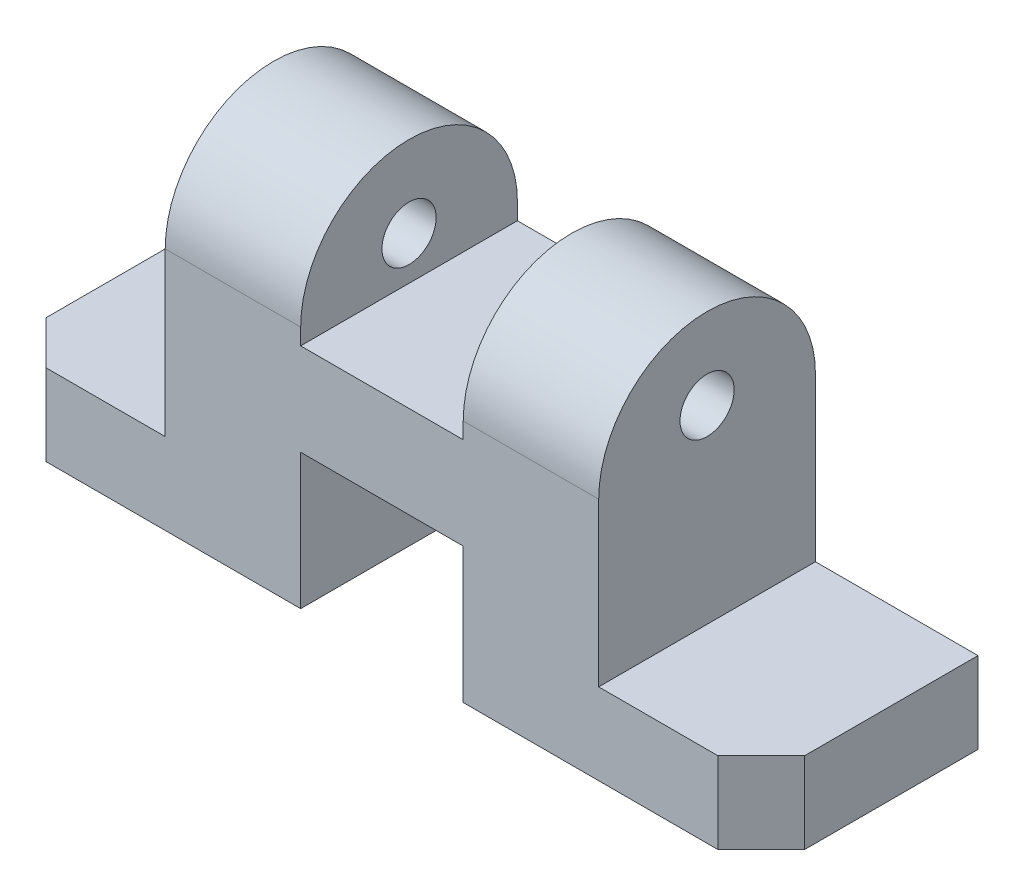
ISO-10303-21;
HEADER;
FILE_DESCRIPTION(('STEP AP214'),'2;1');
FILE_NAME('part.step','',(''),(''),'','','');
FILE_SCHEMA(('AUTOMOTIVE_DESIGN { 1 0 10303 214 1 1 1 1 }'));
ENDSEC;
DATA;
#1=APPLICATION_CONTEXT('core data for automotive mechanical design processes');
#2=APPLICATION_PROTOCOL_DEFINITION('international standard','automotive_design',2000,#1);
#3=PRODUCT_CONTEXT('',#1,'mechanical');
#4=PRODUCT('Part','Part','',(#3));
#5=PRODUCT_RELATED_PRODUCT_CATEGORY('part','',(#4));
#6=PRODUCT_DEFINITION_FORMATION('','',#4);
#7=PRODUCT_DEFINITION_CONTEXT('part definition',#1,'design');
#8=PRODUCT_DEFINITION('design','',#6,#7);
#9=PRODUCT_DEFINITION_SHAPE('','',#8);
#10=(LENGTH_UNIT() NAMED_UNIT(*) SI_UNIT(.MILLI.,.METRE.));
#11=(NAMED_UNIT(*) PLANE_ANGLE_UNIT() SI_UNIT($,.RADIAN.));
#12=(NAMED_UNIT(*) SI_UNIT($,.STERADIAN.) SOLID_ANGLE_UNIT());
#13=UNCERTAINTY_MEASURE_WITH_UNIT(LENGTH_MEASURE(1.E-05),#10,'distance_accuracy_value','');
#14=(GEOMETRIC_REPRESENTATION_CONTEXT(3) GLOBAL_UNCERTAINTY_ASSIGNED_CONTEXT((#13)) GLOBAL_UNIT_ASSIGNED_CONTEXT((#10,
#11,#12)) REPRESENTATION_CONTEXT('',''));
#15=CARTESIAN_POINT('',(0.,0.,0.));
#16=DIRECTION('',(0.,0.,1.));
#17=DIRECTION('',(1.,0.,0.));
#18=AXIS2_PLACEMENT_3D('',#15,#16,#17);
#19=CARTESIAN_POINT('',(40.,15.,20.));
#20=DIRECTION('',(-1.,0.,0.));
#21=DIRECTION('',(0.,0.,1.));
#22=AXIS2_PLACEMENT_3D('',#19,#20,#21);
#23=PLANE('',#22);
#24=CARTESIAN_POINT('',(40.,50.,0.));
#25=DIRECTION('',(1.,0.,0.));
#26=DIRECTION('',(0.,0.,-1.));
#27=AXIS2_PLACEMENT_3D('',#24,#25,#26);
#28=CIRCLE('',#27,5.00000000000001);
#29=CARTESIAN_POINT('',(40.,50.,-5.00000000000001));
#30=VERTEX_POINT('',#29);
#31=EDGE_CURVE('E312',#30,#30,#28,.T.);
#32=ORIENTED_EDGE('',*,*,#31,.F.);
#33=EDGE_LOOP('',(#32));
#34=FACE_BOUND('',#33,.T.);
#35=CARTESIAN_POINT('',(40.,45.,0.));
#36=DIRECTION('',(-1.,0.,0.));
#37=DIRECTION('',(0.,0.,1.));
#38=AXIS2_PLACEMENT_3D('',#35,#36,#37);
#39=CIRCLE('',#38,20.);
#40=CARTESIAN_POINT('',(40.,45.,-20.));
#41=VERTEX_POINT('',#40);
#42=CARTESIAN_POINT('',(40.,45.,20.));
#43=VERTEX_POINT('',#42);
#44=EDGE_CURVE('E216',#41,#43,#39,.F.);
#45=ORIENTED_EDGE('',*,*,#44,.T.);
#46=DIRECTION('',(0.,1.,0.));
#47=VECTOR('',#46,1.);
#48=CARTESIAN_POINT('',(40.,15.,20.));
#49=LINE('',#48,#47);
#50=CARTESIAN_POINT('',(40.,15.,20.));
#51=VERTEX_POINT('',#50);
#52=EDGE_CURVE('E382',#51,#43,#49,.T.);
#53=ORIENTED_EDGE('',*,*,#52,.F.);
#54=DIRECTION('',(0.,0.,-1.));
#55=VECTOR('',#54,1.);
#56=CARTESIAN_POINT('',(40.,15.,20.));
#57=LINE('',#56,#55);
#58=CARTESIAN_POINT('',(40.,15.,-20.));
#59=VERTEX_POINT('',#58);
#60=EDGE_CURVE('E277',#51,#59,#57,.T.);
#61=ORIENTED_EDGE('',*,*,#60,.T.);
#62=DIRECTION('',(0.,1.,0.));
#63=VECTOR('',#62,1.);
#64=CARTESIAN_POINT('',(40.,15.,-20.));
#65=LINE('',#64,#63);
#66=EDGE_CURVE('E236',#59,#41,#65,.T.);
#67=ORIENTED_EDGE('',*,*,#66,.T.);
#68=EDGE_LOOP('',(#45,#53,#61,#67));
#69=FACE_BOUND('',#68,.T.);
#70=ADVANCED_FACE('F47',(#34,#69),#23,.F.);
#71=CARTESIAN_POINT('',(15.,65.,20.));
#72=DIRECTION('',(1.,0.,0.));
#73=DIRECTION('',(0.,1.,0.));
#74=AXIS2_PLACEMENT_3D('',#71,#72,#73);
#75=PLANE('',#74);
#76=CARTESIAN_POINT('',(15.,50.,0.));
#77=DIRECTION('',(1.,0.,0.));
#78=DIRECTION('',(0.,1.,0.));
#79=AXIS2_PLACEMENT_3D('',#76,#77,#78);
#80=CIRCLE('',#79,5.);
#81=CARTESIAN_POINT('',(15.,55.,0.));
#82=VERTEX_POINT('',#81);
#83=EDGE_CURVE('E307',#82,#82,#80,.T.);
#84=ORIENTED_EDGE('',*,*,#83,.T.);
#85=EDGE_LOOP('',(#84));
#86=FACE_BOUND('',#85,.T.);
#87=DIRECTION('',(0.,-1.,0.));
#88=VECTOR('',#87,1.);
#89=CARTESIAN_POINT('',(15.,65.,20.));
#90=LINE('',#89,#88);
#91=CARTESIAN_POINT('',(15.,45.,20.));
#92=VERTEX_POINT('',#91);
#93=CARTESIAN_POINT('',(15.,42.,20.));
#94=VERTEX_POINT('',#93);
#95=EDGE_CURVE('E354',#92,#94,#90,.T.);
#96=ORIENTED_EDGE('',*,*,#95,.F.);
#97=CARTESIAN_POINT('',(15.,45.,0.));
#98=DIRECTION('',(1.,0.,0.));
#99=DIRECTION('',(0.,1.,0.));
#100=AXIS2_PLACEMENT_3D('',#97,#98,#99);
#101=CIRCLE('',#100,20.);
#102=CARTESIAN_POINT('',(15.,45.,-20.));
#103=VERTEX_POINT('',#102);
#104=EDGE_CURVE('E353',#92,#103,#101,.F.);
#105=ORIENTED_EDGE('',*,*,#104,.T.);
#106=DIRECTION('',(0.,-1.,0.));
#107=VECTOR('',#106,1.);
#108=CARTESIAN_POINT('',(15.,65.,-20.));
#109=LINE('',#108,#107);
#110=CARTESIAN_POINT('',(15.,42.,-20.));
#111=VERTEX_POINT('',#110);
#112=EDGE_CURVE('E240',#103,#111,#109,.T.);
#113=ORIENTED_EDGE('',*,*,#112,.T.);
#114=DIRECTION('',(0.,0.,-1.));
#115=VECTOR('',#114,1.);
#116=CARTESIAN_POINT('',(15.,42.,20.));
#117=LINE('',#116,#115);
#118=EDGE_CURVE('E273',#94,#111,#117,.T.);
#119=ORIENTED_EDGE('',*,*,#118,.F.);
#120=EDGE_LOOP('',(#96,#105,#113,#119));
#121=FACE_BOUND('',#120,.T.);
#122=ADVANCED_FACE('F352',(#86,#121),#75,.F.);
#123=CARTESIAN_POINT('',(-15.,65.,20.));
#124=DIRECTION('',(-1.,0.,0.));
#125=DIRECTION('',(0.,-1.,0.));
#126=AXIS2_PLACEMENT_3D('',#123,#124,#125);
#127=PLANE('',#126);
#128=CARTESIAN_POINT('',(-15.,50.,0.));
#129=DIRECTION('',(-1.,0.,0.));
#130=DIRECTION('',(0.,-1.,0.));
#131=AXIS2_PLACEMENT_3D('',#128,#129,#130);
#132=CIRCLE('',#131,5.);
#133=CARTESIAN_POINT('',(-15.,45.,0.));
#134=VERTEX_POINT('',#133);
#135=EDGE_CURVE('E311',#134,#134,#132,.T.);
#136=ORIENTED_EDGE('',*,*,#135,.T.);
#137=EDGE_LOOP('',(#136));
#138=FACE_BOUND('',#137,.T.);
#139=CARTESIAN_POINT('',(-15.,45.,0.));
#140=DIRECTION('',(-1.,0.,0.));
#141=DIRECTION('',(0.,-1.,0.));
#142=AXIS2_PLACEMENT_3D('',#139,#140,#141);
#143=CIRCLE('',#142,20.);
#144=CARTESIAN_POINT('',(-15.,45.,-20.));
#145=VERTEX_POINT('',#144);
#146=CARTESIAN_POINT('',(-15.,45.,20.));
#147=VERTEX_POINT('',#146);
#148=EDGE_CURVE('E183',#145,#147,#143,.F.);
#149=ORIENTED_EDGE('',*,*,#148,.T.);
#150=DIRECTION('',(0.,1.,0.));
#151=VECTOR('',#150,1.);
#152=CARTESIAN_POINT('',(-15.,65.,20.));
#153=LINE('',#152,#151);
#154=CARTESIAN_POINT('',(-15.,42.,20.));
#155=VERTEX_POINT('',#154);
#156=EDGE_CURVE('E192',#155,#147,#153,.T.);
#157=ORIENTED_EDGE('',*,*,#156,.F.);
#158=DIRECTION('',(0.,0.,-1.));
#159=VECTOR('',#158,1.);
#160=CARTESIAN_POINT('',(-15.,42.,20.));
#161=LINE('',#160,#159);
#162=CARTESIAN_POINT('',(-15.,42.,-20.));
#163=VERTEX_POINT('',#162);
#164=EDGE_CURVE('E269',#155,#163,#161,.T.);
#165=ORIENTED_EDGE('',*,*,#164,.T.);
#166=DIRECTION('',(0.,1.,0.));
#167=VECTOR('',#166,1.);
#168=CARTESIAN_POINT('',(-15.,65.,-20.));
#169=LINE('',#168,#167);
#170=EDGE_CURVE('E246',#163,#145,#169,.T.);
#171=ORIENTED_EDGE('',*,*,#170,.T.);
#172=EDGE_LOOP('',(#149,#157,#165,#171));
#173=FACE_BOUND('',#172,.T.);
#174=ADVANCED_FACE('F341',(#138,#173),#127,.F.);
#175=CARTESIAN_POINT('',(-40.,15.,20.));
#176=DIRECTION('',(1.,0.,0.));
#177=DIRECTION('',(0.,0.,-1.));
#178=AXIS2_PLACEMENT_3D('',#175,#176,#177);
#179=PLANE('',#178);
#180=CARTESIAN_POINT('',(-40.,50.,0.));
#181=DIRECTION('',(1.,0.,0.));
#182=DIRECTION('',(0.,0.,-1.));
#183=AXIS2_PLACEMENT_3D('',#180,#181,#182);
#184=CIRCLE('',#183,5.);
#185=CARTESIAN_POINT('',(-40.,50.,-5.));
#186=VERTEX_POINT('',#185);
#187=EDGE_CURVE('E184',#186,#186,#184,.T.);
#188=ORIENTED_EDGE('',*,*,#187,.T.);
#189=EDGE_LOOP('',(#188));
#190=FACE_BOUND('',#189,.T.);
#191=DIRECTION('',(0.,-1.,0.));
#192=VECTOR('',#191,1.);
#193=CARTESIAN_POINT('',(-40.,15.,20.));
#194=LINE('',#193,#192);
#195=CARTESIAN_POINT('',(-40.,45.,20.));
#196=VERTEX_POINT('',#195);
#197=CARTESIAN_POINT('',(-40.,15.,20.));
#198=VERTEX_POINT('',#197);
#199=EDGE_CURVE('E189',#196,#198,#194,.T.);
#200=ORIENTED_EDGE('',*,*,#199,.F.);
#201=CARTESIAN_POINT('',(-40.,45.,0.));
#202=DIRECTION('',(1.,0.,0.));
#203=DIRECTION('',(0.,0.,1.));
#204=AXIS2_PLACEMENT_3D('',#201,#202,#203);
#205=CIRCLE('',#204,20.);
#206=CARTESIAN_POINT('',(-40.,45.,-20.));
#207=VERTEX_POINT('',#206);
#208=EDGE_CURVE('E172',#207,#196,#205,.T.);
#209=ORIENTED_EDGE('',*,*,#208,.F.);
#210=DIRECTION('',(0.,-1.,0.));
#211=VECTOR('',#210,1.);
#212=CARTESIAN_POINT('',(-40.,15.,-20.));
#213=LINE('',#212,#211);
#214=CARTESIAN_POINT('',(-40.,15.,-20.));
#215=VERTEX_POINT('',#214);
#216=EDGE_CURVE('E250',#207,#215,#213,.T.);
#217=ORIENTED_EDGE('',*,*,#216,.T.);
#218=DIRECTION('',(0.,0.,-1.));
#219=VECTOR('',#218,1.);
#220=CARTESIAN_POINT('',(-40.,15.,20.));
#221=LINE('',#220,#219);
#222=EDGE_CURVE('E198',#198,#215,#221,.T.);
#223=ORIENTED_EDGE('',*,*,#222,.F.);
#224=EDGE_LOOP('',(#200,#209,#217,#223));
#225=FACE_BOUND('',#224,.T.);
#226=ADVANCED_FACE('F196',(#190,#225),#179,.F.);
#227=CARTESIAN_POINT('',(0.,0.,20.));
#228=DIRECTION('',(0.,0.,1.));
#229=DIRECTION('',(1.,0.,0.));
#230=AXIS2_PLACEMENT_3D('',#227,#228,#229);
#231=PLANE('',#230);
#232=DIRECTION('',(-1.,0.,0.));
#233=VECTOR('',#232,1.);
#234=CARTESIAN_POINT('',(-70.,15.,20.));
#235=LINE('',#234,#233);
#236=CARTESIAN_POINT('',(-62.,15.,20.));
#237=VERTEX_POINT('',#236);
#238=EDGE_CURVE('E201',#198,#237,#235,.T.);
#239=ORIENTED_EDGE('',*,*,#238,.T.);
#240=DIRECTION('',(0.,-1.,0.));
#241=VECTOR('',#240,1.);
#242=CARTESIAN_POINT('',(-62.,0.,20.));
#243=LINE('',#242,#241);
#244=CARTESIAN_POINT('',(-62.,0.,20.));
#245=VERTEX_POINT('',#244);
#246=EDGE_CURVE('E317',#237,#245,#243,.T.);
#247=ORIENTED_EDGE('',*,*,#246,.T.);
#248=DIRECTION('',(1.,0.,0.));
#249=VECTOR('',#248,1.);
#250=CARTESIAN_POINT('',(-70.,0.,20.));
#251=LINE('',#250,#249);
#252=CARTESIAN_POINT('',(-15.,0.,20.));
#253=VERTEX_POINT('',#252);
#254=EDGE_CURVE('E261',#245,#253,#251,.T.);
#255=ORIENTED_EDGE('',*,*,#254,.T.);
#256=DIRECTION('',(0.,1.,0.));
#257=VECTOR('',#256,1.);
#258=CARTESIAN_POINT('',(-15.,0.,20.));
#259=LINE('',#258,#257);
#260=CARTESIAN_POINT('',(-15.,25.,20.));
#261=VERTEX_POINT('',#260);
#262=EDGE_CURVE('E366',#253,#261,#259,.T.);
#263=ORIENTED_EDGE('',*,*,#262,.T.);
#264=DIRECTION('',(1.,0.,0.));
#265=VECTOR('',#264,1.);
#266=CARTESIAN_POINT('',(-15.,25.,20.));
#267=LINE('',#266,#265);
#268=CARTESIAN_POINT('',(15.,25.,20.));
#269=VERTEX_POINT('',#268);
#270=EDGE_CURVE('E369',#261,#269,#267,.T.);
#271=ORIENTED_EDGE('',*,*,#270,.T.);
#272=DIRECTION('',(0.,-1.,0.));
#273=VECTOR('',#272,1.);
#274=CARTESIAN_POINT('',(15.,25.,20.));
#275=LINE('',#274,#273);
#276=CARTESIAN_POINT('',(15.,0.,20.));
#277=VERTEX_POINT('',#276);
#278=EDGE_CURVE('E372',#269,#277,#275,.T.);
#279=ORIENTED_EDGE('',*,*,#278,.T.);
#280=DIRECTION('',(1.,0.,0.));
#281=VECTOR('',#280,1.);
#282=CARTESIAN_POINT('',(15.,0.,20.));
#283=LINE('',#282,#281);
#284=CARTESIAN_POINT('',(62.,0.,20.));
#285=VERTEX_POINT('',#284);
#286=EDGE_CURVE('E375',#277,#285,#283,.T.);
#287=ORIENTED_EDGE('',*,*,#286,.T.);
#288=DIRECTION('',(0.,1.,0.));
#289=VECTOR('',#288,1.);
#290=CARTESIAN_POINT('',(62.,15.,20.));
#291=LINE('',#290,#289);
#292=CARTESIAN_POINT('',(62.,15.,20.));
#293=VERTEX_POINT('',#292);
#294=EDGE_CURVE('E313',#285,#293,#291,.T.);
#295=ORIENTED_EDGE('',*,*,#294,.T.);
#296=DIRECTION('',(-1.,0.,0.));
#297=VECTOR('',#296,1.);
#298=CARTESIAN_POINT('',(70.,15.,20.));
#299=LINE('',#298,#297);
#300=EDGE_CURVE('E379',#293,#51,#299,.T.);
#301=ORIENTED_EDGE('',*,*,#300,.T.);
#302=ORIENTED_EDGE('',*,*,#52,.T.);
#303=DIRECTION('',(-1.,0.,0.));
#304=VECTOR('',#303,1.);
#305=CARTESIAN_POINT('',(70.,45.,20.));
#306=LINE('',#305,#304);
#307=EDGE_CURVE('E194',#43,#92,#306,.T.);
#308=ORIENTED_EDGE('',*,*,#307,.T.);
#309=ORIENTED_EDGE('',*,*,#95,.T.);
#310=DIRECTION('',(-1.,0.,0.));
#311=VECTOR('',#310,1.);
#312=CARTESIAN_POINT('',(-15.,42.,20.));
#313=LINE('',#312,#311);
#314=EDGE_CURVE('E207',#94,#155,#313,.T.);
#315=ORIENTED_EDGE('',*,*,#314,.T.);
#316=ORIENTED_EDGE('',*,*,#156,.T.);
#317=EDGE_CURVE('E175',#147,#196,#306,.T.);
#318=ORIENTED_EDGE('',*,*,#317,.T.);
#319=ORIENTED_EDGE('',*,*,#199,.T.);
#320=EDGE_LOOP('',(#239,#247,#255,#263,#271,#279,#287,#295,#301,#302,#308,#309,#315,#316,#318,#319));
#321=FACE_BOUND('',#320,.T.);
#322=ADVANCED_FACE('F188',(#321),#231,.T.);
#323=CARTESIAN_POINT('',(-70.,0.,20.));
#324=DIRECTION('',(0.,1.,0.));
#325=DIRECTION('',(0.,0.,1.));
#326=AXIS2_PLACEMENT_3D('',#323,#324,#325);
#327=PLANE('',#326);
#328=ORIENTED_EDGE('',*,*,#254,.F.);
#329=DIRECTION('',(-0.707106781186546,0.,-0.707106781186549));
#330=VECTOR('',#329,1.);
#331=CARTESIAN_POINT('',(-62.,0.,20.));
#332=LINE('',#331,#330);
#333=CARTESIAN_POINT('',(-70.,0.,12.));
#334=VERTEX_POINT('',#333);
#335=EDGE_CURVE('E321',#245,#334,#332,.T.);
#336=ORIENTED_EDGE('',*,*,#335,.T.);
#337=DIRECTION('',(0.,0.,-1.));
#338=VECTOR('',#337,1.);
#339=CARTESIAN_POINT('',(-70.,0.,20.));
#340=LINE('',#339,#338);
#341=CARTESIAN_POINT('',(-70.,0.,-20.));
#342=VERTEX_POINT('',#341);
#343=EDGE_CURVE('E205',#334,#342,#340,.T.);
#344=ORIENTED_EDGE('',*,*,#343,.T.);
#345=DIRECTION('',(1.,0.,0.));
#346=VECTOR('',#345,1.);
#347=CARTESIAN_POINT('',(-70.,0.,-20.));
#348=LINE('',#347,#346);
#349=CARTESIAN_POINT('',(-15.,0.,-20.));
#350=VERTEX_POINT('',#349);
#351=EDGE_CURVE('E211',#342,#350,#348,.T.);
#352=ORIENTED_EDGE('',*,*,#351,.T.);
#353=DIRECTION('',(0.,0.,-1.));
#354=VECTOR('',#353,1.);
#355=CARTESIAN_POINT('',(-15.,0.,20.));
#356=LINE('',#355,#354);
#357=EDGE_CURVE('E299',#253,#350,#356,.T.);
#358=ORIENTED_EDGE('',*,*,#357,.F.);
#359=EDGE_LOOP('',(#328,#336,#344,#352,#358));
#360=FACE_BOUND('',#359,.T.);
#361=ADVANCED_FACE('F420',(#360),#327,.F.);
#362=CARTESIAN_POINT('',(-15.,0.,20.));
#363=DIRECTION('',(-1.,0.,0.));
#364=DIRECTION('',(0.,0.,1.));
#365=AXIS2_PLACEMENT_3D('',#362,#363,#364);
#366=PLANE('',#365);
#367=DIRECTION('',(0.,1.,0.));
#368=VECTOR('',#367,1.);
#369=CARTESIAN_POINT('',(-15.,0.,-20.));
#370=LINE('',#369,#368);
#371=CARTESIAN_POINT('',(-15.,25.,-20.));
#372=VERTEX_POINT('',#371);
#373=EDGE_CURVE('E215',#350,#372,#370,.T.);
#374=ORIENTED_EDGE('',*,*,#373,.T.);
#375=DIRECTION('',(0.,0.,-1.));
#376=VECTOR('',#375,1.);
#377=CARTESIAN_POINT('',(-15.,25.,20.));
#378=LINE('',#377,#376);
#379=EDGE_CURVE('E295',#261,#372,#378,.T.);
#380=ORIENTED_EDGE('',*,*,#379,.F.);
#381=ORIENTED_EDGE('',*,*,#262,.F.);
#382=ORIENTED_EDGE('',*,*,#357,.T.);
#383=EDGE_LOOP('',(#374,#380,#381,#382));
#384=FACE_BOUND('',#383,.T.);
#385=ADVANCED_FACE('F414',(#384),#366,.F.);
#386=CARTESIAN_POINT('',(-15.,25.,20.));
#387=DIRECTION('',(0.,1.,0.));
#388=DIRECTION('',(0.,0.,1.));
#389=AXIS2_PLACEMENT_3D('',#386,#387,#388);
#390=PLANE('',#389);
#391=DIRECTION('',(1.,0.,0.));
#392=VECTOR('',#391,1.);
#393=CARTESIAN_POINT('',(-15.,25.,-20.));
#394=LINE('',#393,#392);
#395=CARTESIAN_POINT('',(15.,25.,-20.));
#396=VERTEX_POINT('',#395);
#397=EDGE_CURVE('E219',#372,#396,#394,.T.);
#398=ORIENTED_EDGE('',*,*,#397,.T.);
#399=DIRECTION('',(0.,0.,-1.));
#400=VECTOR('',#399,1.);
#401=CARTESIAN_POINT('',(15.,25.,20.));
#402=LINE('',#401,#400);
#403=EDGE_CURVE('E291',#269,#396,#402,.T.);
#404=ORIENTED_EDGE('',*,*,#403,.F.);
#405=ORIENTED_EDGE('',*,*,#270,.F.);
#406=ORIENTED_EDGE('',*,*,#379,.T.);
#407=EDGE_LOOP('',(#398,#404,#405,#406));
#408=FACE_BOUND('',#407,.T.);
#409=ADVANCED_FACE('F410',(#408),#390,.F.);
#410=CARTESIAN_POINT('',(15.,25.,20.));
#411=DIRECTION('',(1.,0.,0.));
#412=DIRECTION('',(0.,0.,-1.));
#413=AXIS2_PLACEMENT_3D('',#410,#411,#412);
#414=PLANE('',#413);
#415=DIRECTION('',(0.,-1.,0.));
#416=VECTOR('',#415,1.);
#417=CARTESIAN_POINT('',(15.,25.,-20.));
#418=LINE('',#417,#416);
#419=CARTESIAN_POINT('',(15.,0.,-20.));
#420=VERTEX_POINT('',#419);
#421=EDGE_CURVE('E222',#396,#420,#418,.T.);
#422=ORIENTED_EDGE('',*,*,#421,.T.);
#423=DIRECTION('',(0.,0.,-1.));
#424=VECTOR('',#423,1.);
#425=CARTESIAN_POINT('',(15.,0.,20.));
#426=LINE('',#425,#424);
#427=EDGE_CURVE('E287',#277,#420,#426,.T.);
#428=ORIENTED_EDGE('',*,*,#427,.F.);
#429=ORIENTED_EDGE('',*,*,#278,.F.);
#430=ORIENTED_EDGE('',*,*,#403,.T.);
#431=EDGE_LOOP('',(#422,#428,#429,#430));
#432=FACE_BOUND('',#431,.T.);
#433=ADVANCED_FACE('F405',(#432),#414,.F.);
#434=CARTESIAN_POINT('',(15.,0.,20.));
#435=DIRECTION('',(0.,1.,0.));
#436=DIRECTION('',(0.,0.,1.));
#437=AXIS2_PLACEMENT_3D('',#434,#435,#436);
#438=PLANE('',#437);
#439=DIRECTION('',(0.,0.,-1.));
#440=VECTOR('',#439,1.);
#441=CARTESIAN_POINT('',(70.,0.,20.));
#442=LINE('',#441,#440);
#443=CARTESIAN_POINT('',(70.,0.,12.));
#444=VERTEX_POINT('',#443);
#445=CARTESIAN_POINT('',(70.,0.,-20.));
#446=VERTEX_POINT('',#445);
#447=EDGE_CURVE('E284',#444,#446,#442,.T.);
#448=ORIENTED_EDGE('',*,*,#447,.F.);
#449=DIRECTION('',(-0.707106781186546,0.,0.707106781186549));
#450=VECTOR('',#449,1.);
#451=CARTESIAN_POINT('',(62.,0.,20.));
#452=LINE('',#451,#450);
#453=EDGE_CURVE('E11',#444,#285,#452,.T.);
#454=ORIENTED_EDGE('',*,*,#453,.T.);
#455=ORIENTED_EDGE('',*,*,#286,.F.);
#456=ORIENTED_EDGE('',*,*,#427,.T.);
#457=DIRECTION('',(1.,0.,0.));
#458=VECTOR('',#457,1.);
#459=CARTESIAN_POINT('',(15.,0.,-20.));
#460=LINE('',#459,#458);
#461=EDGE_CURVE('E225',#420,#446,#460,.T.);
#462=ORIENTED_EDGE('',*,*,#461,.T.);
#463=EDGE_LOOP('',(#448,#454,#455,#456,#462));
#464=FACE_BOUND('',#463,.T.);
#465=ADVANCED_FACE('F399',(#464),#438,.F.);
#466=CARTESIAN_POINT('',(70.,0.,20.));
#467=DIRECTION('',(-1.,0.,0.));
#468=DIRECTION('',(0.,0.,1.));
#469=AXIS2_PLACEMENT_3D('',#466,#467,#468);
#470=PLANE('',#469);
#471=DIRECTION('',(0.,0.,-1.));
#472=VECTOR('',#471,1.);
#473=CARTESIAN_POINT('',(70.,15.,20.));
#474=LINE('',#473,#472);
#475=CARTESIAN_POINT('',(70.,15.,12.));
#476=VERTEX_POINT('',#475);
#477=CARTESIAN_POINT('',(70.,15.,-20.));
#478=VERTEX_POINT('',#477);
#479=EDGE_CURVE('E281',#476,#478,#474,.T.);
#480=ORIENTED_EDGE('',*,*,#479,.F.);
#481=DIRECTION('',(0.,-1.,0.));
#482=VECTOR('',#481,1.);
#483=CARTESIAN_POINT('',(70.,0.,12.));
#484=LINE('',#483,#482);
#485=EDGE_CURVE('E57',#476,#444,#484,.T.);
#486=ORIENTED_EDGE('',*,*,#485,.T.);
#487=ORIENTED_EDGE('',*,*,#447,.T.);
#488=DIRECTION('',(0.,1.,0.));
#489=VECTOR('',#488,1.);
#490=CARTESIAN_POINT('',(70.,0.,-20.));
#491=LINE('',#490,#489);
#492=EDGE_CURVE('E229',#446,#478,#491,.T.);
#493=ORIENTED_EDGE('',*,*,#492,.T.);
#494=EDGE_LOOP('',(#480,#486,#487,#493));
#495=FACE_BOUND('',#494,.T.);
#496=ADVANCED_FACE('F396',(#495),#470,.F.);
#497=CARTESIAN_POINT('',(70.,15.,20.));
#498=DIRECTION('',(0.,-1.,0.));
#499=DIRECTION('',(1.,0.,0.));
#500=AXIS2_PLACEMENT_3D('',#497,#498,#499);
#501=PLANE('',#500);
#502=ORIENTED_EDGE('',*,*,#300,.F.);
#503=DIRECTION('',(0.707106781186546,0.,-0.707106781186549));
#504=VECTOR('',#503,1.);
#505=CARTESIAN_POINT('',(62.,15.,20.));
#506=LINE('',#505,#504);
#507=EDGE_CURVE('E71',#293,#476,#506,.T.);
#508=ORIENTED_EDGE('',*,*,#507,.T.);
#509=ORIENTED_EDGE('',*,*,#479,.T.);
#510=DIRECTION('',(-1.,0.,0.));
#511=VECTOR('',#510,1.);
#512=CARTESIAN_POINT('',(70.,15.,-20.));
#513=LINE('',#512,#511);
#514=EDGE_CURVE('E233',#478,#59,#513,.T.);
#515=ORIENTED_EDGE('',*,*,#514,.T.);
#516=ORIENTED_EDGE('',*,*,#60,.F.);
#517=EDGE_LOOP('',(#502,#508,#509,#515,#516));
#518=FACE_BOUND('',#517,.T.);
#519=ADVANCED_FACE('F395',(#518),#501,.F.);
#520=CARTESIAN_POINT('',(-15.,42.,20.));
#521=DIRECTION('',(0.,-1.,0.));
#522=DIRECTION('',(0.,0.,-1.));
#523=AXIS2_PLACEMENT_3D('',#520,#521,#522);
#524=PLANE('',#523);
#525=DIRECTION('',(-1.,0.,0.));
#526=VECTOR('',#525,1.);
#527=CARTESIAN_POINT('',(-15.,42.,-20.));
#528=LINE('',#527,#526);
#529=EDGE_CURVE('E243',#111,#163,#528,.T.);
#530=ORIENTED_EDGE('',*,*,#529,.T.);
#531=ORIENTED_EDGE('',*,*,#164,.F.);
#532=ORIENTED_EDGE('',*,*,#314,.F.);
#533=ORIENTED_EDGE('',*,*,#118,.T.);
#534=EDGE_LOOP('',(#530,#531,#532,#533));
#535=FACE_BOUND('',#534,.T.);
#536=ADVANCED_FACE('F345',(#535),#524,.F.);
#537=CARTESIAN_POINT('',(-70.,15.,20.));
#538=DIRECTION('',(0.,-1.,0.));
#539=DIRECTION('',(1.,0.,0.));
#540=AXIS2_PLACEMENT_3D('',#537,#538,#539);
#541=PLANE('',#540);
#542=DIRECTION('',(0.,0.,-1.));
#543=VECTOR('',#542,1.);
#544=CARTESIAN_POINT('',(-70.,15.,20.));
#545=LINE('',#544,#543);
#546=CARTESIAN_POINT('',(-70.,15.,12.));
#547=VERTEX_POINT('',#546);
#548=CARTESIAN_POINT('',(-70.,15.,-20.));
#549=VERTEX_POINT('',#548);
#550=EDGE_CURVE('E264',#547,#549,#545,.T.);
#551=ORIENTED_EDGE('',*,*,#550,.F.);
#552=DIRECTION('',(0.707106781186546,0.,0.707106781186549));
#553=VECTOR('',#552,1.);
#554=CARTESIAN_POINT('',(-62.,15.,20.));
#555=LINE('',#554,#553);
#556=EDGE_CURVE('E327',#547,#237,#555,.T.);
#557=ORIENTED_EDGE('',*,*,#556,.T.);
#558=ORIENTED_EDGE('',*,*,#238,.F.);
#559=ORIENTED_EDGE('',*,*,#222,.T.);
#560=DIRECTION('',(-1.,0.,0.));
#561=VECTOR('',#560,1.);
#562=CARTESIAN_POINT('',(-70.,15.,-20.));
#563=LINE('',#562,#561);
#564=EDGE_CURVE('E253',#215,#549,#563,.T.);
#565=ORIENTED_EDGE('',*,*,#564,.T.);
#566=EDGE_LOOP('',(#551,#557,#558,#559,#565));
#567=FACE_BOUND('',#566,.T.);
#568=ADVANCED_FACE('F428',(#567),#541,.F.);
#569=CARTESIAN_POINT('',(-70.,0.,20.));
#570=DIRECTION('',(1.,0.,0.));
#571=DIRECTION('',(0.,0.,-1.));
#572=AXIS2_PLACEMENT_3D('',#569,#570,#571);
#573=PLANE('',#572);
#574=ORIENTED_EDGE('',*,*,#343,.F.);
#575=DIRECTION('',(0.,1.,0.));
#576=VECTOR('',#575,1.);
#577=CARTESIAN_POINT('',(-70.,15.,12.));
#578=LINE('',#577,#576);
#579=EDGE_CURVE('E324',#334,#547,#578,.T.);
#580=ORIENTED_EDGE('',*,*,#579,.T.);
#581=ORIENTED_EDGE('',*,*,#550,.T.);
#582=DIRECTION('',(0.,-1.,0.));
#583=VECTOR('',#582,1.);
#584=CARTESIAN_POINT('',(-70.,0.,-20.));
#585=LINE('',#584,#583);
#586=EDGE_CURVE('E257',#549,#342,#585,.T.);
#587=ORIENTED_EDGE('',*,*,#586,.T.);
#588=EDGE_LOOP('',(#574,#580,#581,#587));
#589=FACE_BOUND('',#588,.T.);
#590=ADVANCED_FACE('F424',(#589),#573,.F.);
#591=CARTESIAN_POINT('',(0.,0.,-20.));
#592=DIRECTION('',(0.,0.,1.));
#593=DIRECTION('',(1.,0.,0.));
#594=AXIS2_PLACEMENT_3D('',#591,#592,#593);
#595=PLANE('',#594);
#596=ORIENTED_EDGE('',*,*,#216,.F.);
#597=DIRECTION('',(-1.,0.,0.));
#598=VECTOR('',#597,1.);
#599=CARTESIAN_POINT('',(70.,45.,-20.));
#600=LINE('',#599,#598);
#601=EDGE_CURVE('E178',#207,#145,#600,.F.);
#602=ORIENTED_EDGE('',*,*,#601,.T.);
#603=ORIENTED_EDGE('',*,*,#170,.F.);
#604=ORIENTED_EDGE('',*,*,#529,.F.);
#605=ORIENTED_EDGE('',*,*,#112,.F.);
#606=EDGE_CURVE('E303',#103,#41,#600,.F.);
#607=ORIENTED_EDGE('',*,*,#606,.T.);
#608=ORIENTED_EDGE('',*,*,#66,.F.);
#609=ORIENTED_EDGE('',*,*,#514,.F.);
#610=ORIENTED_EDGE('',*,*,#492,.F.);
#611=ORIENTED_EDGE('',*,*,#461,.F.);
#612=ORIENTED_EDGE('',*,*,#421,.F.);
#613=ORIENTED_EDGE('',*,*,#397,.F.);
#614=ORIENTED_EDGE('',*,*,#373,.F.);
#615=ORIENTED_EDGE('',*,*,#351,.F.);
#616=ORIENTED_EDGE('',*,*,#586,.F.);
#617=ORIENTED_EDGE('',*,*,#564,.F.);
#618=EDGE_LOOP('',(#596,#602,#603,#604,#605,#607,#608,#609,#610,#611,#612,#613,#614,#615,#616,#617));
#619=FACE_BOUND('',#618,.T.);
#620=ADVANCED_FACE('F337',(#619),#595,.F.);
#621=CARTESIAN_POINT('',(70.,45.,0.));
#622=DIRECTION('',(-1.,0.,0.));
#623=DIRECTION('',(0.,0.,1.));
#624=AXIS2_PLACEMENT_3D('',#621,#622,#623);
#625=CYLINDRICAL_SURFACE('',#624,20.);
#626=ORIENTED_EDGE('',*,*,#606,.F.);
#627=ORIENTED_EDGE('',*,*,#104,.F.);
#628=ORIENTED_EDGE('',*,*,#307,.F.);
#629=ORIENTED_EDGE('',*,*,#44,.F.);
#630=EDGE_LOOP('',(#626,#627,#628,#629));
#631=FACE_BOUND('',#630,.T.);
#632=ADVANCED_FACE('F389',(#631),#625,.T.);
#633=ORIENTED_EDGE('',*,*,#601,.F.);
#634=ORIENTED_EDGE('',*,*,#208,.T.);
#635=ORIENTED_EDGE('',*,*,#317,.F.);
#636=ORIENTED_EDGE('',*,*,#148,.F.);
#637=EDGE_LOOP('',(#633,#634,#635,#636));
#638=FACE_BOUND('',#637,.T.);
#639=ADVANCED_FACE('F174',(#638),#625,.T.);
#640=CARTESIAN_POINT('',(40.,50.,0.));
#641=DIRECTION('',(1.,0.,0.));
#642=DIRECTION('',(0.,0.,-1.));
#643=AXIS2_PLACEMENT_3D('',#640,#641,#642);
#644=CYLINDRICAL_SURFACE('',#643,5.);
#645=ORIENTED_EDGE('',*,*,#31,.T.);
#646=EDGE_LOOP('',(#645));
#647=FACE_BOUND('',#646,.T.);
#648=ORIENTED_EDGE('',*,*,#83,.F.);
#649=EDGE_LOOP('',(#648));
#650=FACE_BOUND('',#649,.T.);
#651=ADVANCED_FACE('F440',(#647,#650),#644,.F.);
#652=ORIENTED_EDGE('',*,*,#135,.F.);
#653=EDGE_LOOP('',(#652));
#654=FACE_BOUND('',#653,.T.);
#655=ORIENTED_EDGE('',*,*,#187,.F.);
#656=EDGE_LOOP('',(#655));
#657=FACE_BOUND('',#656,.T.);
#658=ADVANCED_FACE('F433',(#654,#657),#644,.F.);
#659=CARTESIAN_POINT('',(-62.,0.,20.));
#660=DIRECTION('',(-0.707106781186549,0.,0.707106781186546));
#661=DIRECTION('',(0.,1.,0.));
#662=AXIS2_PLACEMENT_3D('',#659,#660,#661);
#663=PLANE('',#662);
#664=ORIENTED_EDGE('',*,*,#556,.F.);
#665=ORIENTED_EDGE('',*,*,#579,.F.);
#666=ORIENTED_EDGE('',*,*,#335,.F.);
#667=ORIENTED_EDGE('',*,*,#246,.F.);
#668=EDGE_LOOP('',(#664,#665,#666,#667));
#669=FACE_BOUND('',#668,.T.);
#670=ADVANCED_FACE('F431',(#669),#663,.T.);
#671=CARTESIAN_POINT('',(62.,0.,20.));
#672=DIRECTION('',(0.707106781186549,0.,0.707106781186546));
#673=DIRECTION('',(0.,-1.,0.));
#674=AXIS2_PLACEMENT_3D('',#671,#672,#673);
#675=PLANE('',#674);
#676=ORIENTED_EDGE('',*,*,#453,.F.);
#677=ORIENTED_EDGE('',*,*,#485,.F.);
#678=ORIENTED_EDGE('',*,*,#507,.F.);
#679=ORIENTED_EDGE('',*,*,#294,.F.);
#680=EDGE_LOOP('',(#676,#677,#678,#679));
#681=FACE_BOUND('',#680,.T.);
#682=ADVANCED_FACE('F50',(#681),#675,.T.);
#683=CLOSED_SHELL('',(#70,#122,#174,#226,#322,#361,#385,#409,#433,#465,#496,#519,#536,#568,#590,
#620,#632,#639,#651,#658,#670,#682));
#684=MANIFOLD_SOLID_BREP('B2',#683);
#685=ADVANCED_BREP_SHAPE_REPRESENTATION('',(#18,#684),#14);
#686=SHAPE_DEFINITION_REPRESENTATION(#9,#685);
ENDSEC;
END-ISO-10303-21;
